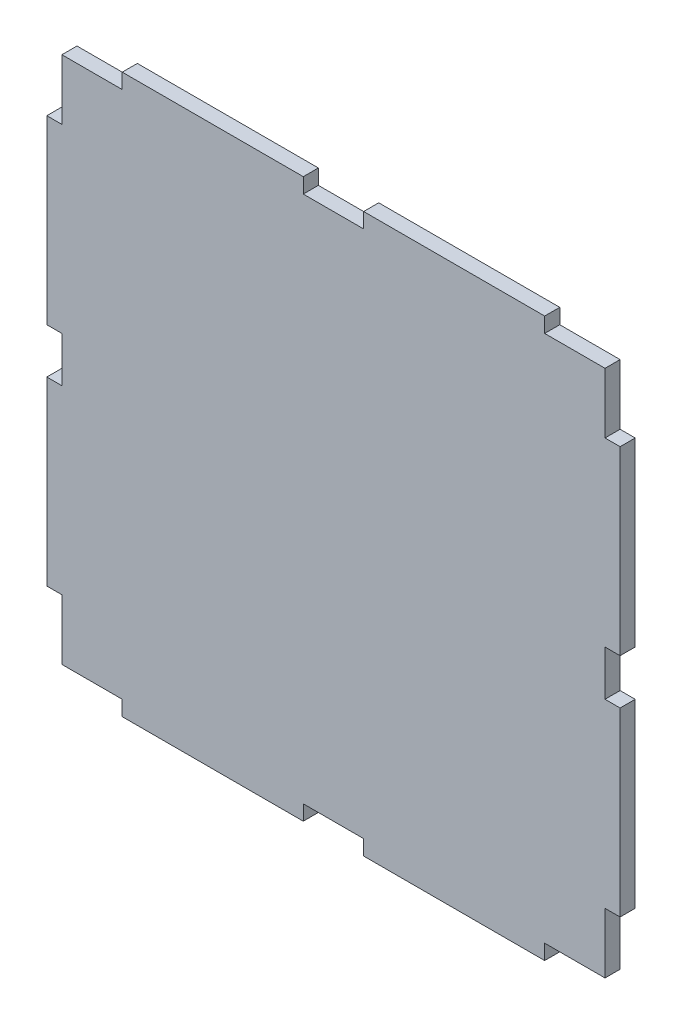
ISO-10303-21;
HEADER;
FILE_DESCRIPTION(('STEP AP214'),'2;1');
FILE_NAME('part.step','',(''),(''),'','','');
FILE_SCHEMA(('AUTOMOTIVE_DESIGN { 1 0 10303 214 1 1 1 1 }'));
ENDSEC;
DATA;
#1=APPLICATION_CONTEXT('core data for automotive mechanical design processes');
#2=APPLICATION_PROTOCOL_DEFINITION('international standard','automotive_design',2000,#1);
#3=PRODUCT_CONTEXT('',#1,'mechanical');
#4=PRODUCT('Part','Part','',(#3));
#5=PRODUCT_RELATED_PRODUCT_CATEGORY('part','',(#4));
#6=PRODUCT_DEFINITION_FORMATION('','',#4);
#7=PRODUCT_DEFINITION_CONTEXT('part definition',#1,'design');
#8=PRODUCT_DEFINITION('design','',#6,#7);
#9=PRODUCT_DEFINITION_SHAPE('','',#8);
#10=(LENGTH_UNIT() NAMED_UNIT(*) SI_UNIT(.MILLI.,.METRE.));
#11=(NAMED_UNIT(*) PLANE_ANGLE_UNIT() SI_UNIT($,.RADIAN.));
#12=(NAMED_UNIT(*) SI_UNIT($,.STERADIAN.) SOLID_ANGLE_UNIT());
#13=UNCERTAINTY_MEASURE_WITH_UNIT(LENGTH_MEASURE(1.E-05),#10,'distance_accuracy_value','');
#14=(GEOMETRIC_REPRESENTATION_CONTEXT(3) GLOBAL_UNCERTAINTY_ASSIGNED_CONTEXT((#13)) GLOBAL_UNIT_ASSIGNED_CONTEXT((#10,
#11,#12)) REPRESENTATION_CONTEXT('',''));
#15=CARTESIAN_POINT('',(0.,0.,0.));
#16=DIRECTION('',(0.,0.,1.));
#17=DIRECTION('',(1.,0.,0.));
#18=AXIS2_PLACEMENT_3D('',#15,#16,#17);
#19=CARTESIAN_POINT('',(0.,-366.128401611212,6.35));
#20=DIRECTION('',(0.,1.,0.));
#21=DIRECTION('',(0.,0.,1.));
#22=AXIS2_PLACEMENT_3D('',#19,#20,#21);
#23=PLANE('',#22);
#24=DIRECTION('',(1.,0.,0.));
#25=VECTOR('',#24,1.);
#26=CARTESIAN_POINT('',(0.,-366.128401611212,0.));
#27=LINE('',#26,#25);
#28=CARTESIAN_POINT('',(138.962770275041,-366.128401611212,0.));
#29=VERTEX_POINT('',#28);
#30=CARTESIAN_POINT('',(145.312770275041,-366.128401611212,0.));
#31=VERTEX_POINT('',#30);
#32=EDGE_CURVE('E553',#29,#31,#27,.T.);
#33=ORIENTED_EDGE('',*,*,#32,.T.);
#34=DIRECTION('',(0.,0.,-1.));
#35=VECTOR('',#34,1.);
#36=CARTESIAN_POINT('',(145.312770275041,-366.128401611212,6.35));
#37=LINE('',#36,#35);
#38=CARTESIAN_POINT('',(145.312770275041,-366.128401611212,6.35));
#39=VERTEX_POINT('',#38);
#40=EDGE_CURVE('E95',#39,#31,#37,.T.);
#41=ORIENTED_EDGE('',*,*,#40,.F.);
#42=DIRECTION('',(1.,0.,0.));
#43=VECTOR('',#42,1.);
#44=CARTESIAN_POINT('',(0.,-366.128401611212,6.35));
#45=LINE('',#44,#43);
#46=CARTESIAN_POINT('',(138.962770275041,-366.128401611212,6.35));
#47=VERTEX_POINT('',#46);
#48=EDGE_CURVE('E542',#47,#39,#45,.T.);
#49=ORIENTED_EDGE('',*,*,#48,.F.);
#50=DIRECTION('',(0.,0.,-1.));
#51=VECTOR('',#50,1.);
#52=CARTESIAN_POINT('',(138.962770275041,-366.128401611212,6.35));
#53=LINE('',#52,#51);
#54=EDGE_CURVE('E12',#47,#29,#53,.T.);
#55=ORIENTED_EDGE('',*,*,#54,.T.);
#56=EDGE_LOOP('',(#33,#41,#49,#55));
#57=FACE_BOUND('',#56,.T.);
#58=ADVANCED_FACE('F85',(#57),#23,.F.);
#59=CARTESIAN_POINT('',(0.,-289.928401611212,6.35));
#60=DIRECTION('',(0.,1.,0.));
#61=DIRECTION('',(0.,0.,1.));
#62=AXIS2_PLACEMENT_3D('',#59,#60,#61);
#63=PLANE('',#62);
#64=DIRECTION('',(1.,0.,0.));
#65=VECTOR('',#64,1.);
#66=CARTESIAN_POINT('',(0.,-289.928401611212,0.));
#67=LINE('',#66,#65);
#68=CARTESIAN_POINT('',(138.962770275041,-289.928401611212,0.));
#69=VERTEX_POINT('',#68);
#70=CARTESIAN_POINT('',(145.312770275041,-289.928401611212,0.));
#71=VERTEX_POINT('',#70);
#72=EDGE_CURVE('E897',#69,#71,#67,.T.);
#73=ORIENTED_EDGE('',*,*,#72,.F.);
#74=DIRECTION('',(0.,0.,-1.));
#75=VECTOR('',#74,1.);
#76=CARTESIAN_POINT('',(138.962770275041,-289.928401611212,6.35));
#77=LINE('',#76,#75);
#78=CARTESIAN_POINT('',(138.962770275041,-289.928401611212,6.35));
#79=VERTEX_POINT('',#78);
#80=EDGE_CURVE('E104',#79,#69,#77,.T.);
#81=ORIENTED_EDGE('',*,*,#80,.F.);
#82=DIRECTION('',(1.,0.,0.));
#83=VECTOR('',#82,1.);
#84=CARTESIAN_POINT('',(0.,-289.928401611212,6.35));
#85=LINE('',#84,#83);
#86=CARTESIAN_POINT('',(145.312770275041,-289.928401611212,6.35));
#87=VERTEX_POINT('',#86);
#88=EDGE_CURVE('E861',#79,#87,#85,.T.);
#89=ORIENTED_EDGE('',*,*,#88,.T.);
#90=DIRECTION('',(0.,0.,-1.));
#91=VECTOR('',#90,1.);
#92=CARTESIAN_POINT('',(145.312770275041,-289.928401611212,6.35));
#93=LINE('',#92,#91);
#94=EDGE_CURVE('E857',#87,#71,#93,.T.);
#95=ORIENTED_EDGE('',*,*,#94,.T.);
#96=EDGE_LOOP('',(#73,#81,#89,#95));
#97=FACE_BOUND('',#96,.T.);
#98=ADVANCED_FACE('F651',(#97),#63,.T.);
#99=CARTESIAN_POINT('',(138.962770275041,0.,6.35));
#100=DIRECTION('',(-1.,0.,0.));
#101=DIRECTION('',(0.,0.,1.));
#102=AXIS2_PLACEMENT_3D('',#99,#100,#101);
#103=PLANE('',#102);
#104=DIRECTION('',(0.,1.,0.));
#105=VECTOR('',#104,1.);
#106=CARTESIAN_POINT('',(138.962770275041,0.,0.));
#107=LINE('',#106,#105);
#108=EDGE_CURVE('E550',#29,#69,#107,.T.);
#109=ORIENTED_EDGE('',*,*,#108,.F.);
#110=ORIENTED_EDGE('',*,*,#54,.F.);
#111=DIRECTION('',(0.,1.,0.));
#112=VECTOR('',#111,1.);
#113=CARTESIAN_POINT('',(138.962770275041,0.,6.35));
#114=LINE('',#113,#112);
#115=EDGE_CURVE('E899',#47,#79,#114,.T.);
#116=ORIENTED_EDGE('',*,*,#115,.T.);
#117=ORIENTED_EDGE('',*,*,#80,.T.);
#118=EDGE_LOOP('',(#109,#110,#116,#117));
#119=FACE_BOUND('',#118,.T.);
#120=ADVANCED_FACE('F657',(#119),#103,.T.);
#121=CARTESIAN_POINT('',(0.,0.,0.));
#122=DIRECTION('',(0.,0.,1.));
#123=DIRECTION('',(1.,0.,0.));
#124=AXIS2_PLACEMENT_3D('',#121,#122,#123);
#125=PLANE('',#124);
#126=ORIENTED_EDGE('',*,*,#108,.T.);
#127=ORIENTED_EDGE('',*,*,#72,.T.);
#128=DIRECTION('',(0.,-1.,0.));
#129=VECTOR('',#128,1.);
#130=CARTESIAN_POINT('',(145.312770275041,-169.278401611212,0.));
#131=LINE('',#130,#129);
#132=CARTESIAN_POINT('',(145.312770275041,-270.878401611212,0.));
#133=VERTEX_POINT('',#132);
#134=EDGE_CURVE('E343',#133,#71,#131,.T.);
#135=ORIENTED_EDGE('',*,*,#134,.F.);
#136=DIRECTION('',(1.,0.,0.));
#137=VECTOR('',#136,1.);
#138=CARTESIAN_POINT('',(0.,-270.878401611212,0.));
#139=LINE('',#138,#137);
#140=CARTESIAN_POINT('',(138.962770275041,-270.878401611212,0.));
#141=VERTEX_POINT('',#140);
#142=EDGE_CURVE('E510',#141,#133,#139,.T.);
#143=ORIENTED_EDGE('',*,*,#142,.F.);
#144=DIRECTION('',(0.,-1.,0.));
#145=VECTOR('',#144,1.);
#146=CARTESIAN_POINT('',(138.962770275041,0.,0.));
#147=LINE('',#146,#145);
#148=CARTESIAN_POINT('',(138.962770275041,-194.678401611212,0.));
#149=VERTEX_POINT('',#148);
#150=EDGE_CURVE('E329',#149,#141,#147,.T.);
#151=ORIENTED_EDGE('',*,*,#150,.F.);
#152=DIRECTION('',(1.,0.,0.));
#153=VECTOR('',#152,1.);
#154=CARTESIAN_POINT('',(0.,-194.678401611212,0.));
#155=LINE('',#154,#153);
#156=CARTESIAN_POINT('',(145.312770275041,-194.678401611212,0.));
#157=VERTEX_POINT('',#156);
#158=EDGE_CURVE('E341',#149,#157,#155,.T.);
#159=ORIENTED_EDGE('',*,*,#158,.T.);
#160=CARTESIAN_POINT('',(145.312770275041,-169.278401611212,0.));
#161=VERTEX_POINT('',#160);
#162=EDGE_CURVE('E321',#161,#157,#131,.T.);
#163=ORIENTED_EDGE('',*,*,#162,.F.);
#164=DIRECTION('',(1.,0.,0.));
#165=VECTOR('',#164,1.);
#166=CARTESIAN_POINT('',(145.312770275041,-169.278401611212,0.));
#167=LINE('',#166,#165);
#168=CARTESIAN_POINT('',(170.712770275041,-169.278401611212,0.));
#169=VERTEX_POINT('',#168);
#170=EDGE_CURVE('E337',#161,#169,#167,.T.);
#171=ORIENTED_EDGE('',*,*,#170,.T.);
#172=DIRECTION('',(0.,1.,0.));
#173=VECTOR('',#172,1.);
#174=CARTESIAN_POINT('',(170.712770275041,0.,0.));
#175=LINE('',#174,#173);
#176=CARTESIAN_POINT('',(170.712770275041,-162.928401611212,0.));
#177=VERTEX_POINT('',#176);
#178=EDGE_CURVE('E478',#169,#177,#175,.T.);
#179=ORIENTED_EDGE('',*,*,#178,.T.);
#180=DIRECTION('',(1.,0.,0.));
#181=VECTOR('',#180,1.);
#182=CARTESIAN_POINT('',(0.,-162.928401611212,0.));
#183=LINE('',#182,#181);
#184=CARTESIAN_POINT('',(246.912770275041,-162.928401611212,0.));
#185=VERTEX_POINT('',#184);
#186=EDGE_CURVE('E487',#177,#185,#183,.T.);
#187=ORIENTED_EDGE('',*,*,#186,.T.);
#188=DIRECTION('',(0.,1.,0.));
#189=VECTOR('',#188,1.);
#190=CARTESIAN_POINT('',(246.912770275041,0.,0.));
#191=LINE('',#190,#189);
#192=CARTESIAN_POINT('',(246.912770275041,-169.278401611212,0.));
#193=VERTEX_POINT('',#192);
#194=EDGE_CURVE('E484',#193,#185,#191,.T.);
#195=ORIENTED_EDGE('',*,*,#194,.F.);
#196=CARTESIAN_POINT('',(272.312770275041,-169.278401611212,0.));
#197=VERTEX_POINT('',#196);
#198=EDGE_CURVE('E347',#193,#197,#167,.T.);
#199=ORIENTED_EDGE('',*,*,#198,.T.);
#200=DIRECTION('',(0.,1.,0.));
#201=VECTOR('',#200,1.);
#202=CARTESIAN_POINT('',(272.312770275041,0.,0.));
#203=LINE('',#202,#201);
#204=CARTESIAN_POINT('',(272.312770275041,-162.928401611212,0.));
#205=VERTEX_POINT('',#204);
#206=EDGE_CURVE('E430',#197,#205,#203,.T.);
#207=ORIENTED_EDGE('',*,*,#206,.T.);
#208=DIRECTION('',(-1.,0.,0.));
#209=VECTOR('',#208,1.);
#210=CARTESIAN_POINT('',(0.,-162.928401611212,0.));
#211=LINE('',#210,#209);
#212=CARTESIAN_POINT('',(348.512770275041,-162.928401611212,0.));
#213=VERTEX_POINT('',#212);
#214=EDGE_CURVE('E437',#213,#205,#211,.T.);
#215=ORIENTED_EDGE('',*,*,#214,.F.);
#216=DIRECTION('',(0.,1.,0.));
#217=VECTOR('',#216,1.);
#218=CARTESIAN_POINT('',(348.512770275041,0.,0.));
#219=LINE('',#218,#217);
#220=CARTESIAN_POINT('',(348.512770275041,-169.278401611212,0.));
#221=VERTEX_POINT('',#220);
#222=EDGE_CURVE('E364',#221,#213,#219,.T.);
#223=ORIENTED_EDGE('',*,*,#222,.F.);
#224=CARTESIAN_POINT('',(373.912770275041,-169.278401611212,0.));
#225=VERTEX_POINT('',#224);
#226=EDGE_CURVE('E349',#221,#225,#167,.T.);
#227=ORIENTED_EDGE('',*,*,#226,.T.);
#228=DIRECTION('',(0.,-1.,0.));
#229=VECTOR('',#228,1.);
#230=CARTESIAN_POINT('',(373.912770275041,-169.278401611212,0.));
#231=LINE('',#230,#229);
#232=CARTESIAN_POINT('',(373.912770275041,-194.678401611212,0.));
#233=VERTEX_POINT('',#232);
#234=EDGE_CURVE('E353',#225,#233,#231,.T.);
#235=ORIENTED_EDGE('',*,*,#234,.T.);
#236=DIRECTION('',(-1.,0.,0.));
#237=VECTOR('',#236,1.);
#238=CARTESIAN_POINT('',(0.,-194.678401611212,0.));
#239=LINE('',#238,#237);
#240=CARTESIAN_POINT('',(380.262770275041,-194.678401611212,0.));
#241=VERTEX_POINT('',#240);
#242=EDGE_CURVE('E465',#241,#233,#239,.T.);
#243=ORIENTED_EDGE('',*,*,#242,.F.);
#244=DIRECTION('',(0.,-1.,0.));
#245=VECTOR('',#244,1.);
#246=CARTESIAN_POINT('',(380.262770275041,0.,0.));
#247=LINE('',#246,#245);
#248=CARTESIAN_POINT('',(380.262770275041,-270.878401611212,0.));
#249=VERTEX_POINT('',#248);
#250=EDGE_CURVE('E462',#241,#249,#247,.T.);
#251=ORIENTED_EDGE('',*,*,#250,.T.);
#252=DIRECTION('',(-1.,0.,0.));
#253=VECTOR('',#252,1.);
#254=CARTESIAN_POINT('',(0.,-270.878401611212,0.));
#255=LINE('',#254,#253);
#256=CARTESIAN_POINT('',(373.912770275041,-270.878401611212,0.));
#257=VERTEX_POINT('',#256);
#258=EDGE_CURVE('E455',#249,#257,#255,.T.);
#259=ORIENTED_EDGE('',*,*,#258,.T.);
#260=CARTESIAN_POINT('',(373.912770275041,-289.928401611212,0.));
#261=VERTEX_POINT('',#260);
#262=EDGE_CURVE('E351',#257,#261,#231,.T.);
#263=ORIENTED_EDGE('',*,*,#262,.T.);
#264=DIRECTION('',(-1.,0.,0.));
#265=VECTOR('',#264,1.);
#266=CARTESIAN_POINT('',(0.,-289.928401611212,0.));
#267=LINE('',#266,#265);
#268=CARTESIAN_POINT('',(380.262770275041,-289.928401611212,0.));
#269=VERTEX_POINT('',#268);
#270=EDGE_CURVE('E407',#269,#261,#267,.T.);
#271=ORIENTED_EDGE('',*,*,#270,.F.);
#272=DIRECTION('',(0.,1.,0.));
#273=VECTOR('',#272,1.);
#274=CARTESIAN_POINT('',(380.262770275041,0.,0.));
#275=LINE('',#274,#273);
#276=CARTESIAN_POINT('',(380.262770275041,-366.128401611212,0.));
#277=VERTEX_POINT('',#276);
#278=EDGE_CURVE('E404',#277,#269,#275,.T.);
#279=ORIENTED_EDGE('',*,*,#278,.F.);
#280=DIRECTION('',(-1.,0.,0.));
#281=VECTOR('',#280,1.);
#282=CARTESIAN_POINT('',(0.,-366.128401611212,0.));
#283=LINE('',#282,#281);
#284=CARTESIAN_POINT('',(373.912770275041,-366.128401611212,0.));
#285=VERTEX_POINT('',#284);
#286=EDGE_CURVE('E402',#277,#285,#283,.T.);
#287=ORIENTED_EDGE('',*,*,#286,.T.);
#288=CARTESIAN_POINT('',(373.912770275041,-391.528401611212,0.));
#289=VERTEX_POINT('',#288);
#290=EDGE_CURVE('E346',#285,#289,#231,.T.);
#291=ORIENTED_EDGE('',*,*,#290,.T.);
#292=DIRECTION('',(1.,0.,0.));
#293=VECTOR('',#292,1.);
#294=CARTESIAN_POINT('',(145.312770275041,-391.528401611212,0.));
#295=LINE('',#294,#293);
#296=CARTESIAN_POINT('',(348.512770275041,-391.528401611212,0.));
#297=VERTEX_POINT('',#296);
#298=EDGE_CURVE('E375',#297,#289,#295,.T.);
#299=ORIENTED_EDGE('',*,*,#298,.F.);
#300=DIRECTION('',(0.,-1.,0.));
#301=VECTOR('',#300,1.);
#302=CARTESIAN_POINT('',(348.512770275041,0.,0.));
#303=LINE('',#302,#301);
#304=CARTESIAN_POINT('',(348.512770275041,-397.878401611212,0.));
#305=VERTEX_POINT('',#304);
#306=EDGE_CURVE('E563',#297,#305,#303,.T.);
#307=ORIENTED_EDGE('',*,*,#306,.T.);
#308=DIRECTION('',(-1.,0.,0.));
#309=VECTOR('',#308,1.);
#310=CARTESIAN_POINT('',(-2.89851550177049E-13,-397.878401611211,0.));
#311=LINE('',#310,#309);
#312=CARTESIAN_POINT('',(272.312770275041,-397.878401611212,0.));
#313=VERTEX_POINT('',#312);
#314=EDGE_CURVE('E571',#305,#313,#311,.T.);
#315=ORIENTED_EDGE('',*,*,#314,.T.);
#316=DIRECTION('',(0.,-1.,0.));
#317=VECTOR('',#316,1.);
#318=CARTESIAN_POINT('',(272.312770275041,0.,0.));
#319=LINE('',#318,#317);
#320=CARTESIAN_POINT('',(272.312770275041,-391.528401611212,0.));
#321=VERTEX_POINT('',#320);
#322=EDGE_CURVE('E426',#321,#313,#319,.T.);
#323=ORIENTED_EDGE('',*,*,#322,.F.);
#324=CARTESIAN_POINT('',(246.912770275041,-391.528401611212,0.));
#325=VERTEX_POINT('',#324);
#326=EDGE_CURVE('E376',#325,#321,#295,.T.);
#327=ORIENTED_EDGE('',*,*,#326,.F.);
#328=DIRECTION('',(0.,-1.,0.));
#329=VECTOR('',#328,1.);
#330=CARTESIAN_POINT('',(246.912770275041,0.,0.));
#331=LINE('',#330,#329);
#332=CARTESIAN_POINT('',(246.912770275041,-397.878401611212,0.));
#333=VERTEX_POINT('',#332);
#334=EDGE_CURVE('E868',#325,#333,#331,.T.);
#335=ORIENTED_EDGE('',*,*,#334,.T.);
#336=DIRECTION('',(1.,0.,0.));
#337=VECTOR('',#336,1.);
#338=CARTESIAN_POINT('',(0.,-397.878401611212,0.));
#339=LINE('',#338,#337);
#340=CARTESIAN_POINT('',(170.712770275041,-397.878401611212,0.));
#341=VERTEX_POINT('',#340);
#342=EDGE_CURVE('E875',#341,#333,#339,.T.);
#343=ORIENTED_EDGE('',*,*,#342,.F.);
#344=DIRECTION('',(0.,-1.,0.));
#345=VECTOR('',#344,1.);
#346=CARTESIAN_POINT('',(170.712770275041,0.,0.));
#347=LINE('',#346,#345);
#348=CARTESIAN_POINT('',(170.712770275041,-391.528401611212,0.));
#349=VERTEX_POINT('',#348);
#350=EDGE_CURVE('E582',#349,#341,#347,.T.);
#351=ORIENTED_EDGE('',*,*,#350,.F.);
#352=CARTESIAN_POINT('',(145.312770275041,-391.528401611212,0.));
#353=VERTEX_POINT('',#352);
#354=EDGE_CURVE('E378',#353,#349,#295,.T.);
#355=ORIENTED_EDGE('',*,*,#354,.F.);
#356=EDGE_CURVE('E312',#31,#353,#131,.T.);
#357=ORIENTED_EDGE('',*,*,#356,.F.);
#358=ORIENTED_EDGE('',*,*,#32,.F.);
#359=EDGE_LOOP('',(#126,#127,#135,#143,#151,#159,#163,#171,#179,#187,#195,#199,#207,#215,#223,
#227,#235,#243,#251,#259,#263,#271,#279,#287,#291,#299,#307,#315,#323,#327,#335,#343,#351,#355,
#357,#358));
#360=FACE_BOUND('',#359,.T.);
#361=ADVANCED_FACE('F335',(#360),#125,.F.);
#362=CARTESIAN_POINT('',(0.,0.,6.35));
#363=DIRECTION('',(0.,0.,1.));
#364=DIRECTION('',(1.,0.,0.));
#365=AXIS2_PLACEMENT_3D('',#362,#363,#364);
#366=PLANE('',#365);
#367=ORIENTED_EDGE('',*,*,#115,.F.);
#368=ORIENTED_EDGE('',*,*,#48,.T.);
#369=DIRECTION('',(0.,-1.,0.));
#370=VECTOR('',#369,1.);
#371=CARTESIAN_POINT('',(145.312770275041,-169.278401611212,6.35));
#372=LINE('',#371,#370);
#373=CARTESIAN_POINT('',(145.312770275041,-391.528401611212,6.35));
#374=VERTEX_POINT('',#373);
#375=EDGE_CURVE('E529',#39,#374,#372,.T.);
#376=ORIENTED_EDGE('',*,*,#375,.T.);
#377=DIRECTION('',(1.,0.,0.));
#378=VECTOR('',#377,1.);
#379=CARTESIAN_POINT('',(145.312770275041,-391.528401611212,6.35));
#380=LINE('',#379,#378);
#381=CARTESIAN_POINT('',(170.712770275041,-391.528401611212,6.35));
#382=VERTEX_POINT('',#381);
#383=EDGE_CURVE('E527',#374,#382,#380,.T.);
#384=ORIENTED_EDGE('',*,*,#383,.T.);
#385=DIRECTION('',(0.,-1.,0.));
#386=VECTOR('',#385,1.);
#387=CARTESIAN_POINT('',(170.712770275041,0.,6.35));
#388=LINE('',#387,#386);
#389=CARTESIAN_POINT('',(170.712770275041,-397.878401611212,6.35));
#390=VERTEX_POINT('',#389);
#391=EDGE_CURVE('E865',#382,#390,#388,.T.);
#392=ORIENTED_EDGE('',*,*,#391,.T.);
#393=DIRECTION('',(1.,0.,0.));
#394=VECTOR('',#393,1.);
#395=CARTESIAN_POINT('',(0.,-397.878401611212,6.35));
#396=LINE('',#395,#394);
#397=CARTESIAN_POINT('',(246.912770275041,-397.878401611212,6.35));
#398=VERTEX_POINT('',#397);
#399=EDGE_CURVE('E867',#390,#398,#396,.T.);
#400=ORIENTED_EDGE('',*,*,#399,.T.);
#401=DIRECTION('',(0.,-1.,0.));
#402=VECTOR('',#401,1.);
#403=CARTESIAN_POINT('',(246.912770275041,0.,6.35));
#404=LINE('',#403,#402);
#405=CARTESIAN_POINT('',(246.912770275041,-391.528401611212,6.35));
#406=VERTEX_POINT('',#405);
#407=EDGE_CURVE('E870',#406,#398,#404,.T.);
#408=ORIENTED_EDGE('',*,*,#407,.F.);
#409=CARTESIAN_POINT('',(272.312770275041,-391.528401611212,6.35));
#410=VERTEX_POINT('',#409);
#411=EDGE_CURVE('E530',#406,#410,#380,.T.);
#412=ORIENTED_EDGE('',*,*,#411,.T.);
#413=DIRECTION('',(0.,-1.,0.));
#414=VECTOR('',#413,1.);
#415=CARTESIAN_POINT('',(272.312770275041,0.,6.35));
#416=LINE('',#415,#414);
#417=CARTESIAN_POINT('',(272.312770275041,-397.878401611212,6.35));
#418=VERTEX_POINT('',#417);
#419=EDGE_CURVE('E560',#410,#418,#416,.T.);
#420=ORIENTED_EDGE('',*,*,#419,.T.);
#421=DIRECTION('',(-1.,0.,0.));
#422=VECTOR('',#421,1.);
#423=CARTESIAN_POINT('',(-2.89851550177049E-13,-397.878401611211,6.35));
#424=LINE('',#423,#422);
#425=CARTESIAN_POINT('',(348.512770275041,-397.878401611212,6.35));
#426=VERTEX_POINT('',#425);
#427=EDGE_CURVE('E562',#426,#418,#424,.T.);
#428=ORIENTED_EDGE('',*,*,#427,.F.);
#429=DIRECTION('',(0.,-1.,0.));
#430=VECTOR('',#429,1.);
#431=CARTESIAN_POINT('',(348.512770275041,0.,6.35));
#432=LINE('',#431,#430);
#433=CARTESIAN_POINT('',(348.512770275041,-391.528401611212,6.35));
#434=VERTEX_POINT('',#433);
#435=EDGE_CURVE('E566',#434,#426,#432,.T.);
#436=ORIENTED_EDGE('',*,*,#435,.F.);
#437=CARTESIAN_POINT('',(373.912770275041,-391.528401611212,6.35));
#438=VERTEX_POINT('',#437);
#439=EDGE_CURVE('E394',#434,#438,#380,.T.);
#440=ORIENTED_EDGE('',*,*,#439,.T.);
#441=DIRECTION('',(0.,-1.,0.));
#442=VECTOR('',#441,1.);
#443=CARTESIAN_POINT('',(373.912770275041,-169.278401611212,6.35));
#444=LINE('',#443,#442);
#445=CARTESIAN_POINT('',(373.912770275041,-366.128401611212,6.35));
#446=VERTEX_POINT('',#445);
#447=EDGE_CURVE('E390',#446,#438,#444,.T.);
#448=ORIENTED_EDGE('',*,*,#447,.F.);
#449=DIRECTION('',(-1.,0.,0.));
#450=VECTOR('',#449,1.);
#451=CARTESIAN_POINT('',(0.,-366.128401611212,6.35));
#452=LINE('',#451,#450);
#453=CARTESIAN_POINT('',(380.262770275041,-366.128401611212,6.35));
#454=VERTEX_POINT('',#453);
#455=EDGE_CURVE('E419',#454,#446,#452,.T.);
#456=ORIENTED_EDGE('',*,*,#455,.F.);
#457=DIRECTION('',(0.,1.,0.));
#458=VECTOR('',#457,1.);
#459=CARTESIAN_POINT('',(380.262770275041,0.,6.35));
#460=LINE('',#459,#458);
#461=CARTESIAN_POINT('',(380.262770275041,-289.928401611212,6.35));
#462=VERTEX_POINT('',#461);
#463=EDGE_CURVE('E406',#454,#462,#460,.T.);
#464=ORIENTED_EDGE('',*,*,#463,.T.);
#465=DIRECTION('',(-1.,0.,0.));
#466=VECTOR('',#465,1.);
#467=CARTESIAN_POINT('',(0.,-289.928401611212,6.35));
#468=LINE('',#467,#466);
#469=CARTESIAN_POINT('',(373.912770275041,-289.928401611212,6.35));
#470=VERTEX_POINT('',#469);
#471=EDGE_CURVE('E410',#462,#470,#468,.T.);
#472=ORIENTED_EDGE('',*,*,#471,.T.);
#473=CARTESIAN_POINT('',(373.912770275041,-270.878401611212,6.35));
#474=VERTEX_POINT('',#473);
#475=EDGE_CURVE('E526',#474,#470,#444,.T.);
#476=ORIENTED_EDGE('',*,*,#475,.F.);
#477=DIRECTION('',(-1.,0.,0.));
#478=VECTOR('',#477,1.);
#479=CARTESIAN_POINT('',(0.,-270.878401611212,6.35));
#480=LINE('',#479,#478);
#481=CARTESIAN_POINT('',(380.262770275041,-270.878401611212,6.35));
#482=VERTEX_POINT('',#481);
#483=EDGE_CURVE('E458',#482,#474,#480,.T.);
#484=ORIENTED_EDGE('',*,*,#483,.F.);
#485=DIRECTION('',(0.,-1.,0.));
#486=VECTOR('',#485,1.);
#487=CARTESIAN_POINT('',(380.262770275041,0.,6.35));
#488=LINE('',#487,#486);
#489=CARTESIAN_POINT('',(380.262770275041,-194.678401611212,6.35));
#490=VERTEX_POINT('',#489);
#491=EDGE_CURVE('E451',#490,#482,#488,.T.);
#492=ORIENTED_EDGE('',*,*,#491,.F.);
#493=DIRECTION('',(-1.,0.,0.));
#494=VECTOR('',#493,1.);
#495=CARTESIAN_POINT('',(0.,-194.678401611212,6.35));
#496=LINE('',#495,#494);
#497=CARTESIAN_POINT('',(373.912770275041,-194.678401611212,6.35));
#498=VERTEX_POINT('',#497);
#499=EDGE_CURVE('E454',#490,#498,#496,.T.);
#500=ORIENTED_EDGE('',*,*,#499,.T.);
#501=CARTESIAN_POINT('',(373.912770275041,-169.278401611212,6.35));
#502=VERTEX_POINT('',#501);
#503=EDGE_CURVE('E524',#502,#498,#444,.T.);
#504=ORIENTED_EDGE('',*,*,#503,.F.);
#505=DIRECTION('',(1.,0.,0.));
#506=VECTOR('',#505,1.);
#507=CARTESIAN_POINT('',(145.312770275041,-169.278401611212,6.35));
#508=LINE('',#507,#506);
#509=CARTESIAN_POINT('',(348.512770275041,-169.278401611212,6.35));
#510=VERTEX_POINT('',#509);
#511=EDGE_CURVE('E342',#510,#502,#508,.T.);
#512=ORIENTED_EDGE('',*,*,#511,.F.);
#513=DIRECTION('',(0.,1.,0.));
#514=VECTOR('',#513,1.);
#515=CARTESIAN_POINT('',(348.512770275041,0.,6.35));
#516=LINE('',#515,#514);
#517=CARTESIAN_POINT('',(348.512770275041,-162.928401611212,6.35));
#518=VERTEX_POINT('',#517);
#519=EDGE_CURVE('E427',#510,#518,#516,.T.);
#520=ORIENTED_EDGE('',*,*,#519,.T.);
#521=DIRECTION('',(-1.,0.,0.));
#522=VECTOR('',#521,1.);
#523=CARTESIAN_POINT('',(0.,-162.928401611212,6.35));
#524=LINE('',#523,#522);
#525=CARTESIAN_POINT('',(272.312770275041,-162.928401611212,6.35));
#526=VERTEX_POINT('',#525);
#527=EDGE_CURVE('E429',#518,#526,#524,.T.);
#528=ORIENTED_EDGE('',*,*,#527,.T.);
#529=DIRECTION('',(0.,1.,0.));
#530=VECTOR('',#529,1.);
#531=CARTESIAN_POINT('',(272.312770275041,0.,6.35));
#532=LINE('',#531,#530);
#533=CARTESIAN_POINT('',(272.312770275041,-169.278401611212,6.35));
#534=VERTEX_POINT('',#533);
#535=EDGE_CURVE('E432',#534,#526,#532,.T.);
#536=ORIENTED_EDGE('',*,*,#535,.F.);
#537=CARTESIAN_POINT('',(246.912770275041,-169.278401611212,6.35));
#538=VERTEX_POINT('',#537);
#539=EDGE_CURVE('E523',#538,#534,#508,.T.);
#540=ORIENTED_EDGE('',*,*,#539,.F.);
#541=DIRECTION('',(0.,1.,0.));
#542=VECTOR('',#541,1.);
#543=CARTESIAN_POINT('',(246.912770275041,0.,6.35));
#544=LINE('',#543,#542);
#545=CARTESIAN_POINT('',(246.912770275041,-162.928401611212,6.35));
#546=VERTEX_POINT('',#545);
#547=EDGE_CURVE('E475',#538,#546,#544,.T.);
#548=ORIENTED_EDGE('',*,*,#547,.T.);
#549=DIRECTION('',(1.,0.,0.));
#550=VECTOR('',#549,1.);
#551=CARTESIAN_POINT('',(0.,-162.928401611212,6.35));
#552=LINE('',#551,#550);
#553=CARTESIAN_POINT('',(170.712770275041,-162.928401611212,6.35));
#554=VERTEX_POINT('',#553);
#555=EDGE_CURVE('E477',#554,#546,#552,.T.);
#556=ORIENTED_EDGE('',*,*,#555,.F.);
#557=DIRECTION('',(0.,1.,0.));
#558=VECTOR('',#557,1.);
#559=CARTESIAN_POINT('',(170.712770275041,0.,6.35));
#560=LINE('',#559,#558);
#561=CARTESIAN_POINT('',(170.712770275041,-169.278401611212,6.35));
#562=VERTEX_POINT('',#561);
#563=EDGE_CURVE('E481',#562,#554,#560,.T.);
#564=ORIENTED_EDGE('',*,*,#563,.F.);
#565=CARTESIAN_POINT('',(145.312770275041,-169.278401611212,6.35));
#566=VERTEX_POINT('',#565);
#567=EDGE_CURVE('E521',#566,#562,#508,.T.);
#568=ORIENTED_EDGE('',*,*,#567,.F.);
#569=CARTESIAN_POINT('',(145.312770275041,-194.678401611212,6.35));
#570=VERTEX_POINT('',#569);
#571=EDGE_CURVE('E324',#566,#570,#372,.T.);
#572=ORIENTED_EDGE('',*,*,#571,.T.);
#573=DIRECTION('',(1.,0.,0.));
#574=VECTOR('',#573,1.);
#575=CARTESIAN_POINT('',(0.,-194.678401611212,6.35));
#576=LINE('',#575,#574);
#577=CARTESIAN_POINT('',(138.962770275041,-194.678401611212,6.35));
#578=VERTEX_POINT('',#577);
#579=EDGE_CURVE('E504',#578,#570,#576,.T.);
#580=ORIENTED_EDGE('',*,*,#579,.F.);
#581=DIRECTION('',(0.,-1.,0.));
#582=VECTOR('',#581,1.);
#583=CARTESIAN_POINT('',(138.962770275041,0.,6.35));
#584=LINE('',#583,#582);
#585=CARTESIAN_POINT('',(138.962770275041,-270.878401611212,6.35));
#586=VERTEX_POINT('',#585);
#587=EDGE_CURVE('E498',#578,#586,#584,.T.);
#588=ORIENTED_EDGE('',*,*,#587,.T.);
#589=DIRECTION('',(1.,0.,0.));
#590=VECTOR('',#589,1.);
#591=CARTESIAN_POINT('',(0.,-270.878401611212,6.35));
#592=LINE('',#591,#590);
#593=CARTESIAN_POINT('',(145.312770275041,-270.878401611212,6.35));
#594=VERTEX_POINT('',#593);
#595=EDGE_CURVE('E501',#586,#594,#592,.T.);
#596=ORIENTED_EDGE('',*,*,#595,.T.);
#597=EDGE_CURVE('E531',#594,#87,#372,.T.);
#598=ORIENTED_EDGE('',*,*,#597,.T.);
#599=ORIENTED_EDGE('',*,*,#88,.F.);
#600=EDGE_LOOP('',(#367,#368,#376,#384,#392,#400,#408,#412,#420,#428,#436,#440,#448,#456,#464,
#472,#476,#484,#492,#500,#504,#512,#520,#528,#536,#540,#548,#556,#564,#568,#572,#580,#588,#596,
#598,#599));
#601=FACE_BOUND('',#600,.T.);
#602=ADVANCED_FACE('F538',(#601),#366,.T.);
#603=CARTESIAN_POINT('',(0.,-194.678401611212,6.35));
#604=DIRECTION('',(0.,1.,0.));
#605=DIRECTION('',(0.,0.,1.));
#606=AXIS2_PLACEMENT_3D('',#603,#604,#605);
#607=PLANE('',#606);
#608=ORIENTED_EDGE('',*,*,#158,.F.);
#609=DIRECTION('',(0.,0.,-1.));
#610=VECTOR('',#609,1.);
#611=CARTESIAN_POINT('',(138.962770275041,-194.678401611212,6.35));
#612=LINE('',#611,#610);
#613=EDGE_CURVE('E507',#578,#149,#612,.T.);
#614=ORIENTED_EDGE('',*,*,#613,.F.);
#615=ORIENTED_EDGE('',*,*,#579,.T.);
#616=DIRECTION('',(0.,0.,-1.));
#617=VECTOR('',#616,1.);
#618=CARTESIAN_POINT('',(145.312770275041,-194.678401611212,6.35));
#619=LINE('',#618,#617);
#620=EDGE_CURVE('E515',#570,#157,#619,.T.);
#621=ORIENTED_EDGE('',*,*,#620,.T.);
#622=EDGE_LOOP('',(#608,#614,#615,#621));
#623=FACE_BOUND('',#622,.T.);
#624=ADVANCED_FACE('F649',(#623),#607,.T.);
#625=CARTESIAN_POINT('',(138.962770275041,0.,6.35));
#626=DIRECTION('',(1.,0.,0.));
#627=DIRECTION('',(0.,0.,-1.));
#628=AXIS2_PLACEMENT_3D('',#625,#626,#627);
#629=PLANE('',#628);
#630=ORIENTED_EDGE('',*,*,#150,.T.);
#631=DIRECTION('',(0.,0.,-1.));
#632=VECTOR('',#631,1.);
#633=CARTESIAN_POINT('',(138.962770275041,-270.878401611212,6.35));
#634=LINE('',#633,#632);
#635=EDGE_CURVE('E488',#586,#141,#634,.T.);
#636=ORIENTED_EDGE('',*,*,#635,.F.);
#637=ORIENTED_EDGE('',*,*,#587,.F.);
#638=ORIENTED_EDGE('',*,*,#613,.T.);
#639=EDGE_LOOP('',(#630,#636,#637,#638));
#640=FACE_BOUND('',#639,.T.);
#641=ADVANCED_FACE('F677',(#640),#629,.F.);
#642=CARTESIAN_POINT('',(170.712770275041,0.,6.35));
#643=DIRECTION('',(1.,0.,0.));
#644=DIRECTION('',(0.,0.,-1.));
#645=AXIS2_PLACEMENT_3D('',#642,#643,#644);
#646=PLANE('',#645);
#647=ORIENTED_EDGE('',*,*,#350,.T.);
#648=DIRECTION('',(0.,0.,-1.));
#649=VECTOR('',#648,1.);
#650=CARTESIAN_POINT('',(170.712770275041,-397.878401611212,6.35));
#651=LINE('',#650,#649);
#652=EDGE_CURVE('E551',#390,#341,#651,.T.);
#653=ORIENTED_EDGE('',*,*,#652,.F.);
#654=ORIENTED_EDGE('',*,*,#391,.F.);
#655=DIRECTION('',(0.,0.,-1.));
#656=VECTOR('',#655,1.);
#657=CARTESIAN_POINT('',(170.712770275041,-391.528401611212,6.35));
#658=LINE('',#657,#656);
#659=EDGE_CURVE('E547',#382,#349,#658,.T.);
#660=ORIENTED_EDGE('',*,*,#659,.T.);
#661=EDGE_LOOP('',(#647,#653,#654,#660));
#662=FACE_BOUND('',#661,.T.);
#663=ADVANCED_FACE('F673',(#662),#646,.F.);
#664=CARTESIAN_POINT('',(0.,-397.878401611212,6.35));
#665=DIRECTION('',(0.,1.,0.));
#666=DIRECTION('',(0.,0.,1.));
#667=AXIS2_PLACEMENT_3D('',#664,#665,#666);
#668=PLANE('',#667);
#669=ORIENTED_EDGE('',*,*,#342,.T.);
#670=DIRECTION('',(0.,0.,-1.));
#671=VECTOR('',#670,1.);
#672=CARTESIAN_POINT('',(246.912770275041,-397.878401611212,6.35));
#673=LINE('',#672,#671);
#674=EDGE_CURVE('E556',#398,#333,#673,.T.);
#675=ORIENTED_EDGE('',*,*,#674,.F.);
#676=ORIENTED_EDGE('',*,*,#399,.F.);
#677=ORIENTED_EDGE('',*,*,#652,.T.);
#678=EDGE_LOOP('',(#669,#675,#676,#677));
#679=FACE_BOUND('',#678,.T.);
#680=ADVANCED_FACE('F669',(#679),#668,.F.);
#681=CARTESIAN_POINT('',(246.912770275041,0.,6.35));
#682=DIRECTION('',(1.,0.,0.));
#683=DIRECTION('',(0.,0.,-1.));
#684=AXIS2_PLACEMENT_3D('',#681,#682,#683);
#685=PLANE('',#684);
#686=ORIENTED_EDGE('',*,*,#334,.F.);
#687=DIRECTION('',(0.,0.,-1.));
#688=VECTOR('',#687,1.);
#689=CARTESIAN_POINT('',(246.912770275041,-391.528401611212,6.35));
#690=LINE('',#689,#688);
#691=EDGE_CURVE('E873',#406,#325,#690,.T.);
#692=ORIENTED_EDGE('',*,*,#691,.F.);
#693=ORIENTED_EDGE('',*,*,#407,.T.);
#694=ORIENTED_EDGE('',*,*,#674,.T.);
#695=EDGE_LOOP('',(#686,#692,#693,#694));
#696=FACE_BOUND('',#695,.T.);
#697=ADVANCED_FACE('F665',(#696),#685,.T.);
#698=CARTESIAN_POINT('',(272.312770275041,0.,6.35));
#699=DIRECTION('',(1.,0.,0.));
#700=DIRECTION('',(0.,0.,-1.));
#701=AXIS2_PLACEMENT_3D('',#698,#699,#700);
#702=PLANE('',#701);
#703=ORIENTED_EDGE('',*,*,#322,.T.);
#704=DIRECTION('',(0.,0.,-1.));
#705=VECTOR('',#704,1.);
#706=CARTESIAN_POINT('',(272.312770275041,-397.878401611212,6.35));
#707=LINE('',#706,#705);
#708=EDGE_CURVE('E578',#418,#313,#707,.T.);
#709=ORIENTED_EDGE('',*,*,#708,.F.);
#710=ORIENTED_EDGE('',*,*,#419,.F.);
#711=DIRECTION('',(0.,0.,-1.));
#712=VECTOR('',#711,1.);
#713=CARTESIAN_POINT('',(272.312770275041,-391.528401611212,6.35));
#714=LINE('',#713,#712);
#715=EDGE_CURVE('E580',#410,#321,#714,.T.);
#716=ORIENTED_EDGE('',*,*,#715,.T.);
#717=EDGE_LOOP('',(#703,#709,#710,#716));
#718=FACE_BOUND('',#717,.T.);
#719=ADVANCED_FACE('F668',(#718),#702,.F.);
#720=CARTESIAN_POINT('',(-2.89851550177049E-13,-397.878401611211,6.35));
#721=DIRECTION('',(0.,-1.,0.));
#722=DIRECTION('',(1.,0.,0.));
#723=AXIS2_PLACEMENT_3D('',#720,#721,#722);
#724=PLANE('',#723);
#725=ORIENTED_EDGE('',*,*,#314,.F.);
#726=DIRECTION('',(0.,0.,-1.));
#727=VECTOR('',#726,1.);
#728=CARTESIAN_POINT('',(348.512770275041,-397.878401611212,6.35));
#729=LINE('',#728,#727);
#730=EDGE_CURVE('E576',#426,#305,#729,.T.);
#731=ORIENTED_EDGE('',*,*,#730,.F.);
#732=ORIENTED_EDGE('',*,*,#427,.T.);
#733=ORIENTED_EDGE('',*,*,#708,.T.);
#734=EDGE_LOOP('',(#725,#731,#732,#733));
#735=FACE_BOUND('',#734,.T.);
#736=ADVANCED_FACE('F681',(#735),#724,.T.);
#737=CARTESIAN_POINT('',(348.512770275041,0.,6.35));
#738=DIRECTION('',(1.,0.,0.));
#739=DIRECTION('',(0.,0.,-1.));
#740=AXIS2_PLACEMENT_3D('',#737,#738,#739);
#741=PLANE('',#740);
#742=ORIENTED_EDGE('',*,*,#306,.F.);
#743=DIRECTION('',(0.,0.,-1.));
#744=VECTOR('',#743,1.);
#745=CARTESIAN_POINT('',(348.512770275041,-391.528401611212,6.35));
#746=LINE('',#745,#744);
#747=EDGE_CURVE('E397',#434,#297,#746,.T.);
#748=ORIENTED_EDGE('',*,*,#747,.F.);
#749=ORIENTED_EDGE('',*,*,#435,.T.);
#750=ORIENTED_EDGE('',*,*,#730,.T.);
#751=EDGE_LOOP('',(#742,#748,#749,#750));
#752=FACE_BOUND('',#751,.T.);
#753=ADVANCED_FACE('F678',(#752),#741,.T.);
#754=CARTESIAN_POINT('',(0.,-366.128401611212,6.35));
#755=DIRECTION('',(0.,-1.,0.));
#756=DIRECTION('',(0.,0.,-1.));
#757=AXIS2_PLACEMENT_3D('',#754,#755,#756);
#758=PLANE('',#757);
#759=ORIENTED_EDGE('',*,*,#286,.F.);
#760=DIRECTION('',(0.,0.,-1.));
#761=VECTOR('',#760,1.);
#762=CARTESIAN_POINT('',(380.262770275041,-366.128401611212,6.35));
#763=LINE('',#762,#761);
#764=EDGE_CURVE('E416',#454,#277,#763,.T.);
#765=ORIENTED_EDGE('',*,*,#764,.F.);
#766=ORIENTED_EDGE('',*,*,#455,.T.);
#767=DIRECTION('',(0.,0.,-1.));
#768=VECTOR('',#767,1.);
#769=CARTESIAN_POINT('',(373.912770275041,-366.128401611212,6.35));
#770=LINE('',#769,#768);
#771=EDGE_CURVE('E418',#446,#285,#770,.T.);
#772=ORIENTED_EDGE('',*,*,#771,.T.);
#773=EDGE_LOOP('',(#759,#765,#766,#772));
#774=FACE_BOUND('',#773,.T.);
#775=ADVANCED_FACE('F592',(#774),#758,.T.);
#776=CARTESIAN_POINT('',(380.262770275041,0.,6.35));
#777=DIRECTION('',(-1.,0.,0.));
#778=DIRECTION('',(0.,0.,1.));
#779=AXIS2_PLACEMENT_3D('',#776,#777,#778);
#780=PLANE('',#779);
#781=ORIENTED_EDGE('',*,*,#278,.T.);
#782=DIRECTION('',(0.,0.,-1.));
#783=VECTOR('',#782,1.);
#784=CARTESIAN_POINT('',(380.262770275041,-289.928401611212,6.35));
#785=LINE('',#784,#783);
#786=EDGE_CURVE('E423',#462,#269,#785,.T.);
#787=ORIENTED_EDGE('',*,*,#786,.F.);
#788=ORIENTED_EDGE('',*,*,#463,.F.);
#789=ORIENTED_EDGE('',*,*,#764,.T.);
#790=EDGE_LOOP('',(#781,#787,#788,#789));
#791=FACE_BOUND('',#790,.T.);
#792=ADVANCED_FACE('F589',(#791),#780,.F.);
#793=CARTESIAN_POINT('',(0.,-289.928401611212,6.35));
#794=DIRECTION('',(0.,-1.,0.));
#795=DIRECTION('',(0.,0.,-1.));
#796=AXIS2_PLACEMENT_3D('',#793,#794,#795);
#797=PLANE('',#796);
#798=ORIENTED_EDGE('',*,*,#270,.T.);
#799=DIRECTION('',(0.,0.,-1.));
#800=VECTOR('',#799,1.);
#801=CARTESIAN_POINT('',(373.912770275041,-289.928401611212,6.35));
#802=LINE('',#801,#800);
#803=EDGE_CURVE('E421',#470,#261,#802,.T.);
#804=ORIENTED_EDGE('',*,*,#803,.F.);
#805=ORIENTED_EDGE('',*,*,#471,.F.);
#806=ORIENTED_EDGE('',*,*,#786,.T.);
#807=EDGE_LOOP('',(#798,#804,#805,#806));
#808=FACE_BOUND('',#807,.T.);
#809=ADVANCED_FACE('F600',(#808),#797,.F.);
#810=CARTESIAN_POINT('',(0.,-270.878401611212,6.35));
#811=DIRECTION('',(0.,-1.,0.));
#812=DIRECTION('',(0.,0.,-1.));
#813=AXIS2_PLACEMENT_3D('',#810,#811,#812);
#814=PLANE('',#813);
#815=ORIENTED_EDGE('',*,*,#258,.F.);
#816=DIRECTION('',(0.,0.,-1.));
#817=VECTOR('',#816,1.);
#818=CARTESIAN_POINT('',(380.262770275041,-270.878401611212,6.35));
#819=LINE('',#818,#817);
#820=EDGE_CURVE('E461',#482,#249,#819,.T.);
#821=ORIENTED_EDGE('',*,*,#820,.F.);
#822=ORIENTED_EDGE('',*,*,#483,.T.);
#823=DIRECTION('',(0.,0.,-1.));
#824=VECTOR('',#823,1.);
#825=CARTESIAN_POINT('',(373.912770275041,-270.878401611212,6.35));
#826=LINE('',#825,#824);
#827=EDGE_CURVE('E471',#474,#257,#826,.T.);
#828=ORIENTED_EDGE('',*,*,#827,.T.);
#829=EDGE_LOOP('',(#815,#821,#822,#828));
#830=FACE_BOUND('',#829,.T.);
#831=ADVANCED_FACE('F604',(#830),#814,.T.);
#832=CARTESIAN_POINT('',(380.262770275041,0.,6.35));
#833=DIRECTION('',(1.,0.,0.));
#834=DIRECTION('',(0.,0.,-1.));
#835=AXIS2_PLACEMENT_3D('',#832,#833,#834);
#836=PLANE('',#835);
#837=ORIENTED_EDGE('',*,*,#250,.F.);
#838=DIRECTION('',(0.,0.,-1.));
#839=VECTOR('',#838,1.);
#840=CARTESIAN_POINT('',(380.262770275041,-194.678401611212,6.35));
#841=LINE('',#840,#839);
#842=EDGE_CURVE('E438',#490,#241,#841,.T.);
#843=ORIENTED_EDGE('',*,*,#842,.F.);
#844=ORIENTED_EDGE('',*,*,#491,.T.);
#845=ORIENTED_EDGE('',*,*,#820,.T.);
#846=EDGE_LOOP('',(#837,#843,#844,#845));
#847=FACE_BOUND('',#846,.T.);
#848=ADVANCED_FACE('F608',(#847),#836,.T.);
#849=CARTESIAN_POINT('',(0.,-194.678401611212,6.35));
#850=DIRECTION('',(0.,-1.,0.));
#851=DIRECTION('',(0.,0.,-1.));
#852=AXIS2_PLACEMENT_3D('',#849,#850,#851);
#853=PLANE('',#852);
#854=ORIENTED_EDGE('',*,*,#242,.T.);
#855=DIRECTION('',(0.,0.,-1.));
#856=VECTOR('',#855,1.);
#857=CARTESIAN_POINT('',(373.912770275041,-194.678401611212,6.35));
#858=LINE('',#857,#856);
#859=EDGE_CURVE('E374',#498,#233,#858,.T.);
#860=ORIENTED_EDGE('',*,*,#859,.F.);
#861=ORIENTED_EDGE('',*,*,#499,.F.);
#862=ORIENTED_EDGE('',*,*,#842,.T.);
#863=EDGE_LOOP('',(#854,#860,#861,#862));
#864=FACE_BOUND('',#863,.T.);
#865=ADVANCED_FACE('F610',(#864),#853,.F.);
#866=CARTESIAN_POINT('',(348.512770275041,0.,6.35));
#867=DIRECTION('',(-1.,0.,0.));
#868=DIRECTION('',(0.,0.,1.));
#869=AXIS2_PLACEMENT_3D('',#866,#867,#868);
#870=PLANE('',#869);
#871=ORIENTED_EDGE('',*,*,#222,.T.);
#872=DIRECTION('',(0.,0.,-1.));
#873=VECTOR('',#872,1.);
#874=CARTESIAN_POINT('',(348.512770275041,-162.928401611212,6.35));
#875=LINE('',#874,#873);
#876=EDGE_CURVE('E446',#518,#213,#875,.T.);
#877=ORIENTED_EDGE('',*,*,#876,.F.);
#878=ORIENTED_EDGE('',*,*,#519,.F.);
#879=DIRECTION('',(0.,0.,-1.));
#880=VECTOR('',#879,1.);
#881=CARTESIAN_POINT('',(348.512770275041,-169.278401611212,6.35));
#882=LINE('',#881,#880);
#883=EDGE_CURVE('E449',#510,#221,#882,.T.);
#884=ORIENTED_EDGE('',*,*,#883,.T.);
#885=EDGE_LOOP('',(#871,#877,#878,#884));
#886=FACE_BOUND('',#885,.T.);
#887=ADVANCED_FACE('F614',(#886),#870,.F.);
#888=CARTESIAN_POINT('',(0.,-162.928401611212,6.35));
#889=DIRECTION('',(0.,-1.,0.));
#890=DIRECTION('',(1.,0.,0.));
#891=AXIS2_PLACEMENT_3D('',#888,#889,#890);
#892=PLANE('',#891);
#893=ORIENTED_EDGE('',*,*,#214,.T.);
#894=DIRECTION('',(0.,0.,-1.));
#895=VECTOR('',#894,1.);
#896=CARTESIAN_POINT('',(272.312770275041,-162.928401611212,6.35));
#897=LINE('',#896,#895);
#898=EDGE_CURVE('E444',#526,#205,#897,.T.);
#899=ORIENTED_EDGE('',*,*,#898,.F.);
#900=ORIENTED_EDGE('',*,*,#527,.F.);
#901=ORIENTED_EDGE('',*,*,#876,.T.);
#902=EDGE_LOOP('',(#893,#899,#900,#901));
#903=FACE_BOUND('',#902,.T.);
#904=ADVANCED_FACE('F618',(#903),#892,.F.);
#905=CARTESIAN_POINT('',(272.312770275041,0.,6.35));
#906=DIRECTION('',(-1.,0.,0.));
#907=DIRECTION('',(0.,0.,1.));
#908=AXIS2_PLACEMENT_3D('',#905,#906,#907);
#909=PLANE('',#908);
#910=ORIENTED_EDGE('',*,*,#206,.F.);
#911=DIRECTION('',(0.,0.,-1.));
#912=VECTOR('',#911,1.);
#913=CARTESIAN_POINT('',(272.312770275041,-169.278401611212,6.35));
#914=LINE('',#913,#912);
#915=EDGE_CURVE('E435',#534,#197,#914,.T.);
#916=ORIENTED_EDGE('',*,*,#915,.F.);
#917=ORIENTED_EDGE('',*,*,#535,.T.);
#918=ORIENTED_EDGE('',*,*,#898,.T.);
#919=EDGE_LOOP('',(#910,#916,#917,#918));
#920=FACE_BOUND('',#919,.T.);
#921=ADVANCED_FACE('F625',(#920),#909,.T.);
#922=CARTESIAN_POINT('',(246.912770275041,0.,6.35));
#923=DIRECTION('',(-1.,0.,0.));
#924=DIRECTION('',(0.,0.,1.));
#925=AXIS2_PLACEMENT_3D('',#922,#923,#924);
#926=PLANE('',#925);
#927=ORIENTED_EDGE('',*,*,#194,.T.);
#928=DIRECTION('',(0.,0.,-1.));
#929=VECTOR('',#928,1.);
#930=CARTESIAN_POINT('',(246.912770275041,-162.928401611212,6.35));
#931=LINE('',#930,#929);
#932=EDGE_CURVE('E495',#546,#185,#931,.T.);
#933=ORIENTED_EDGE('',*,*,#932,.F.);
#934=ORIENTED_EDGE('',*,*,#547,.F.);
#935=DIRECTION('',(0.,0.,-1.));
#936=VECTOR('',#935,1.);
#937=CARTESIAN_POINT('',(246.912770275041,-169.278401611212,6.35));
#938=LINE('',#937,#936);
#939=EDGE_CURVE('E466',#538,#193,#938,.T.);
#940=ORIENTED_EDGE('',*,*,#939,.T.);
#941=EDGE_LOOP('',(#927,#933,#934,#940));
#942=FACE_BOUND('',#941,.T.);
#943=ADVANCED_FACE('F631',(#942),#926,.F.);
#944=CARTESIAN_POINT('',(0.,-162.928401611212,6.35));
#945=DIRECTION('',(0.,1.,0.));
#946=DIRECTION('',(0.,0.,1.));
#947=AXIS2_PLACEMENT_3D('',#944,#945,#946);
#948=PLANE('',#947);
#949=ORIENTED_EDGE('',*,*,#186,.F.);
#950=DIRECTION('',(0.,0.,-1.));
#951=VECTOR('',#950,1.);
#952=CARTESIAN_POINT('',(170.712770275041,-162.928401611212,6.35));
#953=LINE('',#952,#951);
#954=EDGE_CURVE('E493',#554,#177,#953,.T.);
#955=ORIENTED_EDGE('',*,*,#954,.F.);
#956=ORIENTED_EDGE('',*,*,#555,.T.);
#957=ORIENTED_EDGE('',*,*,#932,.T.);
#958=EDGE_LOOP('',(#949,#955,#956,#957));
#959=FACE_BOUND('',#958,.T.);
#960=ADVANCED_FACE('F639',(#959),#948,.T.);
#961=CARTESIAN_POINT('',(170.712770275041,0.,6.35));
#962=DIRECTION('',(-1.,0.,0.));
#963=DIRECTION('',(0.,0.,1.));
#964=AXIS2_PLACEMENT_3D('',#961,#962,#963);
#965=PLANE('',#964);
#966=ORIENTED_EDGE('',*,*,#178,.F.);
#967=DIRECTION('',(0.,0.,-1.));
#968=VECTOR('',#967,1.);
#969=CARTESIAN_POINT('',(170.712770275041,-169.278401611212,6.35));
#970=LINE('',#969,#968);
#971=EDGE_CURVE('E345',#562,#169,#970,.T.);
#972=ORIENTED_EDGE('',*,*,#971,.F.);
#973=ORIENTED_EDGE('',*,*,#563,.T.);
#974=ORIENTED_EDGE('',*,*,#954,.T.);
#975=EDGE_LOOP('',(#966,#972,#973,#974));
#976=FACE_BOUND('',#975,.T.);
#977=ADVANCED_FACE('F637',(#976),#965,.T.);
#978=CARTESIAN_POINT('',(0.,-270.878401611212,6.35));
#979=DIRECTION('',(0.,1.,0.));
#980=DIRECTION('',(0.,0.,1.));
#981=AXIS2_PLACEMENT_3D('',#978,#979,#980);
#982=PLANE('',#981);
#983=ORIENTED_EDGE('',*,*,#142,.T.);
#984=DIRECTION('',(0.,0.,-1.));
#985=VECTOR('',#984,1.);
#986=CARTESIAN_POINT('',(145.312770275041,-270.878401611212,6.35));
#987=LINE('',#986,#985);
#988=EDGE_CURVE('E517',#594,#133,#987,.T.);
#989=ORIENTED_EDGE('',*,*,#988,.F.);
#990=ORIENTED_EDGE('',*,*,#595,.F.);
#991=ORIENTED_EDGE('',*,*,#635,.T.);
#992=EDGE_LOOP('',(#983,#989,#990,#991));
#993=FACE_BOUND('',#992,.T.);
#994=ADVANCED_FACE('F646',(#993),#982,.F.);
#995=CARTESIAN_POINT('',(145.312770275041,-169.278401611212,6.35));
#996=DIRECTION('',(1.,0.,0.));
#997=DIRECTION('',(0.,1.,0.));
#998=AXIS2_PLACEMENT_3D('',#995,#996,#997);
#999=PLANE('',#998);
#1000=ORIENTED_EDGE('',*,*,#620,.F.);
#1001=ORIENTED_EDGE('',*,*,#571,.F.);
#1002=DIRECTION('',(0.,0.,-1.));
#1003=VECTOR('',#1002,1.);
#1004=CARTESIAN_POINT('',(145.312770275041,-169.278401611212,6.35));
#1005=LINE('',#1004,#1003);
#1006=EDGE_CURVE('E318',#566,#161,#1005,.T.);
#1007=ORIENTED_EDGE('',*,*,#1006,.T.);
#1008=ORIENTED_EDGE('',*,*,#162,.T.);
#1009=EDGE_LOOP('',(#1000,#1001,#1007,#1008));
#1010=FACE_BOUND('',#1009,.T.);
#1011=ADVANCED_FACE('F320',(#1010),#999,.F.);
#1012=ORIENTED_EDGE('',*,*,#94,.F.);
#1013=ORIENTED_EDGE('',*,*,#597,.F.);
#1014=ORIENTED_EDGE('',*,*,#988,.T.);
#1015=ORIENTED_EDGE('',*,*,#134,.T.);
#1016=EDGE_LOOP('',(#1012,#1013,#1014,#1015));
#1017=FACE_BOUND('',#1016,.T.);
#1018=ADVANCED_FACE('F758',(#1017),#999,.F.);
#1019=ORIENTED_EDGE('',*,*,#375,.F.);
#1020=ORIENTED_EDGE('',*,*,#40,.T.);
#1021=ORIENTED_EDGE('',*,*,#356,.T.);
#1022=DIRECTION('',(0.,0.,-1.));
#1023=VECTOR('',#1022,1.);
#1024=CARTESIAN_POINT('',(145.312770275041,-391.528401611212,6.35));
#1025=LINE('',#1024,#1023);
#1026=EDGE_CURVE('E330',#374,#353,#1025,.T.);
#1027=ORIENTED_EDGE('',*,*,#1026,.F.);
#1028=EDGE_LOOP('',(#1019,#1020,#1021,#1027));
#1029=FACE_BOUND('',#1028,.T.);
#1030=ADVANCED_FACE('F543',(#1029),#999,.F.);
#1031=CARTESIAN_POINT('',(145.312770275041,-391.528401611212,6.35));
#1032=DIRECTION('',(0.,1.,0.));
#1033=DIRECTION('',(-1.,0.,0.));
#1034=AXIS2_PLACEMENT_3D('',#1031,#1032,#1033);
#1035=PLANE('',#1034);
#1036=ORIENTED_EDGE('',*,*,#354,.T.);
#1037=ORIENTED_EDGE('',*,*,#659,.F.);
#1038=ORIENTED_EDGE('',*,*,#383,.F.);
#1039=ORIENTED_EDGE('',*,*,#1026,.T.);
#1040=EDGE_LOOP('',(#1036,#1037,#1038,#1039));
#1041=FACE_BOUND('',#1040,.T.);
#1042=ADVANCED_FACE('F546',(#1041),#1035,.F.);
#1043=ORIENTED_EDGE('',*,*,#691,.T.);
#1044=ORIENTED_EDGE('',*,*,#326,.T.);
#1045=ORIENTED_EDGE('',*,*,#715,.F.);
#1046=ORIENTED_EDGE('',*,*,#411,.F.);
#1047=EDGE_LOOP('',(#1043,#1044,#1045,#1046));
#1048=FACE_BOUND('',#1047,.T.);
#1049=ADVANCED_FACE('F760',(#1048),#1035,.F.);
#1050=ORIENTED_EDGE('',*,*,#439,.F.);
#1051=ORIENTED_EDGE('',*,*,#747,.T.);
#1052=ORIENTED_EDGE('',*,*,#298,.T.);
#1053=DIRECTION('',(0.,0.,-1.));
#1054=VECTOR('',#1053,1.);
#1055=CARTESIAN_POINT('',(373.912770275041,-391.528401611212,6.35));
#1056=LINE('',#1055,#1054);
#1057=EDGE_CURVE('E372',#438,#289,#1056,.T.);
#1058=ORIENTED_EDGE('',*,*,#1057,.F.);
#1059=EDGE_LOOP('',(#1050,#1051,#1052,#1058));
#1060=FACE_BOUND('',#1059,.T.);
#1061=ADVANCED_FACE('F393',(#1060),#1035,.F.);
#1062=CARTESIAN_POINT('',(373.912770275041,-169.278401611212,6.35));
#1063=DIRECTION('',(1.,0.,0.));
#1064=DIRECTION('',(0.,0.,-1.));
#1065=AXIS2_PLACEMENT_3D('',#1062,#1063,#1064);
#1066=PLANE('',#1065);
#1067=ORIENTED_EDGE('',*,*,#290,.F.);
#1068=ORIENTED_EDGE('',*,*,#771,.F.);
#1069=ORIENTED_EDGE('',*,*,#447,.T.);
#1070=ORIENTED_EDGE('',*,*,#1057,.T.);
#1071=EDGE_LOOP('',(#1067,#1068,#1069,#1070));
#1072=FACE_BOUND('',#1071,.T.);
#1073=ADVANCED_FACE('F387',(#1072),#1066,.T.);
#1074=ORIENTED_EDGE('',*,*,#475,.T.);
#1075=ORIENTED_EDGE('',*,*,#803,.T.);
#1076=ORIENTED_EDGE('',*,*,#262,.F.);
#1077=ORIENTED_EDGE('',*,*,#827,.F.);
#1078=EDGE_LOOP('',(#1074,#1075,#1076,#1077));
#1079=FACE_BOUND('',#1078,.T.);
#1080=ADVANCED_FACE('F596',(#1079),#1066,.T.);
#1081=ORIENTED_EDGE('',*,*,#503,.T.);
#1082=ORIENTED_EDGE('',*,*,#859,.T.);
#1083=ORIENTED_EDGE('',*,*,#234,.F.);
#1084=DIRECTION('',(0.,0.,-1.));
#1085=VECTOR('',#1084,1.);
#1086=CARTESIAN_POINT('',(373.912770275041,-169.278401611212,6.35));
#1087=LINE('',#1086,#1085);
#1088=EDGE_CURVE('E89',#502,#225,#1087,.T.);
#1089=ORIENTED_EDGE('',*,*,#1088,.F.);
#1090=EDGE_LOOP('',(#1081,#1082,#1083,#1089));
#1091=FACE_BOUND('',#1090,.T.);
#1092=ADVANCED_FACE('F373',(#1091),#1066,.T.);
#1093=CARTESIAN_POINT('',(145.312770275041,-169.278401611212,6.35));
#1094=DIRECTION('',(0.,1.,0.));
#1095=DIRECTION('',(0.,0.,1.));
#1096=AXIS2_PLACEMENT_3D('',#1093,#1094,#1095);
#1097=PLANE('',#1096);
#1098=ORIENTED_EDGE('',*,*,#883,.F.);
#1099=ORIENTED_EDGE('',*,*,#511,.T.);
#1100=ORIENTED_EDGE('',*,*,#1088,.T.);
#1101=ORIENTED_EDGE('',*,*,#226,.F.);
#1102=EDGE_LOOP('',(#1098,#1099,#1100,#1101));
#1103=FACE_BOUND('',#1102,.T.);
#1104=ADVANCED_FACE('F367',(#1103),#1097,.T.);
#1105=ORIENTED_EDGE('',*,*,#539,.T.);
#1106=ORIENTED_EDGE('',*,*,#915,.T.);
#1107=ORIENTED_EDGE('',*,*,#198,.F.);
#1108=ORIENTED_EDGE('',*,*,#939,.F.);
#1109=EDGE_LOOP('',(#1105,#1106,#1107,#1108));
#1110=FACE_BOUND('',#1109,.T.);
#1111=ADVANCED_FACE('F628',(#1110),#1097,.T.);
#1112=ORIENTED_EDGE('',*,*,#567,.T.);
#1113=ORIENTED_EDGE('',*,*,#971,.T.);
#1114=ORIENTED_EDGE('',*,*,#170,.F.);
#1115=ORIENTED_EDGE('',*,*,#1006,.F.);
#1116=EDGE_LOOP('',(#1112,#1113,#1114,#1115));
#1117=FACE_BOUND('',#1116,.T.);
#1118=ADVANCED_FACE('F87',(#1117),#1097,.T.);
#1119=CLOSED_SHELL('',(#58,#98,#120,#361,#602,#624,#641,#663,#680,#697,#719,#736,#753,#775,#792,
#809,#831,#848,#865,#887,#904,#921,#943,#960,#977,#994,#1011,#1018,#1030,#1042,#1049,#1061,
#1073,#1080,#1092,#1104,#1111,#1118));
#1120=MANIFOLD_SOLID_BREP('B2',#1119);
#1121=ADVANCED_BREP_SHAPE_REPRESENTATION('',(#18,#1120),#14);
#1122=SHAPE_DEFINITION_REPRESENTATION(#9,#1121);
ENDSEC;
END-ISO-10303-21;
